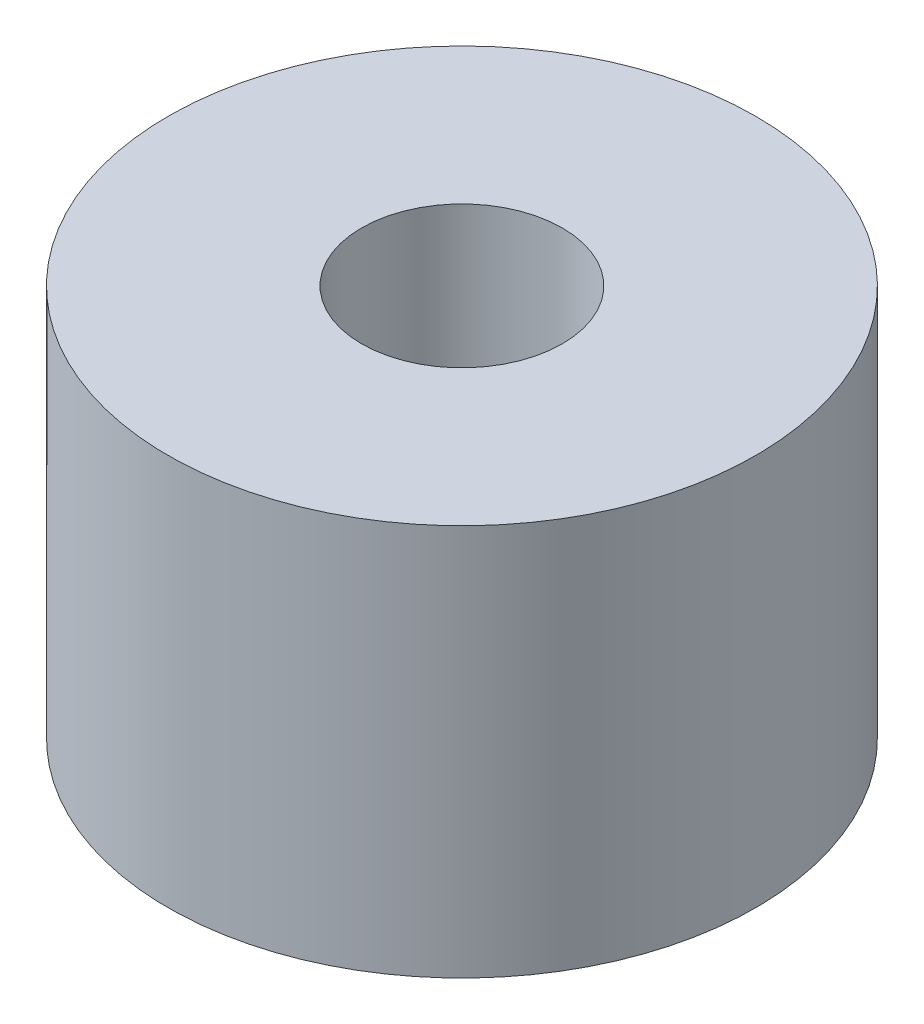
ISO-10303-21;
HEADER;
FILE_DESCRIPTION(('STEP AP214'),'2;1');
FILE_NAME('part.step','',(''),(''),'','','');
FILE_SCHEMA(('AUTOMOTIVE_DESIGN { 1 0 10303 214 1 1 1 1 }'));
ENDSEC;
DATA;
#1=APPLICATION_CONTEXT('core data for automotive mechanical design processes');
#2=APPLICATION_PROTOCOL_DEFINITION('international standard','automotive_design',2000,#1);
#3=PRODUCT_CONTEXT('',#1,'mechanical');
#4=PRODUCT('Part','Part','',(#3));
#5=PRODUCT_RELATED_PRODUCT_CATEGORY('part','',(#4));
#6=PRODUCT_DEFINITION_FORMATION('','',#4);
#7=PRODUCT_DEFINITION_CONTEXT('part definition',#1,'design');
#8=PRODUCT_DEFINITION('design','',#6,#7);
#9=PRODUCT_DEFINITION_SHAPE('','',#8);
#10=(LENGTH_UNIT() NAMED_UNIT(*) SI_UNIT(.MILLI.,.METRE.));
#11=(NAMED_UNIT(*) PLANE_ANGLE_UNIT() SI_UNIT($,.RADIAN.));
#12=(NAMED_UNIT(*) SI_UNIT($,.STERADIAN.) SOLID_ANGLE_UNIT());
#13=UNCERTAINTY_MEASURE_WITH_UNIT(LENGTH_MEASURE(1.E-05),#10,'distance_accuracy_value','');
#14=(GEOMETRIC_REPRESENTATION_CONTEXT(3) GLOBAL_UNCERTAINTY_ASSIGNED_CONTEXT((#13)) GLOBAL_UNIT_ASSIGNED_CONTEXT((#10,
#11,#12)) REPRESENTATION_CONTEXT('',''));
#15=CARTESIAN_POINT('',(0.,0.,0.));
#16=DIRECTION('',(0.,0.,1.));
#17=DIRECTION('',(1.,0.,0.));
#18=AXIS2_PLACEMENT_3D('',#15,#16,#17);
#19=CARTESIAN_POINT('',(0.,8.,0.));
#20=DIRECTION('',(0.,-1.,0.));
#21=DIRECTION('',(0.,0.,-1.));
#22=AXIS2_PLACEMENT_3D('',#19,#20,#21);
#23=CYLINDRICAL_SURFACE('',#22,2.05);
#24=CARTESIAN_POINT('',(0.,0.,0.));
#25=DIRECTION('',(0.,-1.,0.));
#26=DIRECTION('',(0.,0.,-1.));
#27=AXIS2_PLACEMENT_3D('',#24,#25,#26);
#28=CIRCLE('',#27,2.05);
#29=CARTESIAN_POINT('',(0.,0.,-2.05));
#30=VERTEX_POINT('',#29);
#31=EDGE_CURVE('E26',#30,#30,#28,.T.);
#32=ORIENTED_EDGE('',*,*,#31,.T.);
#33=EDGE_LOOP('',(#32));
#34=FACE_BOUND('',#33,.T.);
#35=CARTESIAN_POINT('',(0.,8.,0.));
#36=DIRECTION('',(0.,-1.,0.));
#37=DIRECTION('',(0.,0.,-1.));
#38=AXIS2_PLACEMENT_3D('',#35,#36,#37);
#39=CIRCLE('',#38,2.05);
#40=CARTESIAN_POINT('',(0.,8.,-2.05));
#41=VERTEX_POINT('',#40);
#42=EDGE_CURVE('E17',#41,#41,#39,.T.);
#43=ORIENTED_EDGE('',*,*,#42,.F.);
#44=EDGE_LOOP('',(#43));
#45=FACE_BOUND('',#44,.T.);
#46=ADVANCED_FACE('F14',(#34,#45),#23,.F.);
#47=CARTESIAN_POINT('',(0.,8.,0.));
#48=DIRECTION('',(0.,1.,0.));
#49=DIRECTION('',(0.,0.,1.));
#50=AXIS2_PLACEMENT_3D('',#47,#48,#49);
#51=PLANE('',#50);
#52=ORIENTED_EDGE('',*,*,#42,.T.);
#53=EDGE_LOOP('',(#52));
#54=FACE_BOUND('',#53,.T.);
#55=CARTESIAN_POINT('',(0.,8.,0.));
#56=DIRECTION('',(0.,-1.,0.));
#57=DIRECTION('',(0.,0.,-1.));
#58=AXIS2_PLACEMENT_3D('',#55,#56,#57);
#59=CIRCLE('',#58,6.);
#60=CARTESIAN_POINT('',(0.,8.,-6.));
#61=VERTEX_POINT('',#60);
#62=EDGE_CURVE('E21',#61,#61,#59,.T.);
#63=ORIENTED_EDGE('',*,*,#62,.F.);
#64=EDGE_LOOP('',(#63));
#65=FACE_BOUND('',#64,.T.);
#66=ADVANCED_FACE('F34',(#54,#65),#51,.T.);
#67=CARTESIAN_POINT('',(0.,0.,0.));
#68=DIRECTION('',(0.,1.,0.));
#69=DIRECTION('',(0.,0.,1.));
#70=AXIS2_PLACEMENT_3D('',#67,#68,#69);
#71=PLANE('',#70);
#72=ORIENTED_EDGE('',*,*,#31,.F.);
#73=EDGE_LOOP('',(#72));
#74=FACE_BOUND('',#73,.T.);
#75=CARTESIAN_POINT('',(0.,0.,0.));
#76=DIRECTION('',(0.,-1.,0.));
#77=DIRECTION('',(0.,0.,-1.));
#78=AXIS2_PLACEMENT_3D('',#75,#76,#77);
#79=CIRCLE('',#78,6.);
#80=CARTESIAN_POINT('',(0.,0.,-6.));
#81=VERTEX_POINT('',#80);
#82=EDGE_CURVE('E8',#81,#81,#79,.F.);
#83=ORIENTED_EDGE('',*,*,#82,.F.);
#84=EDGE_LOOP('',(#83));
#85=FACE_BOUND('',#84,.T.);
#86=ADVANCED_FACE('F41',(#74,#85),#71,.F.);
#87=CARTESIAN_POINT('',(0.,8.,0.));
#88=DIRECTION('',(0.,-1.,0.));
#89=DIRECTION('',(0.,0.,-1.));
#90=AXIS2_PLACEMENT_3D('',#87,#88,#89);
#91=CYLINDRICAL_SURFACE('',#90,6.);
#92=ORIENTED_EDGE('',*,*,#82,.T.);
#93=EDGE_LOOP('',(#92));
#94=FACE_BOUND('',#93,.T.);
#95=ORIENTED_EDGE('',*,*,#62,.T.);
#96=EDGE_LOOP('',(#95));
#97=FACE_BOUND('',#96,.T.);
#98=ADVANCED_FACE('F42',(#94,#97),#91,.T.);
#99=CLOSED_SHELL('',(#46,#66,#86,#98));
#100=MANIFOLD_SOLID_BREP('B1',#99);
#101=ADVANCED_BREP_SHAPE_REPRESENTATION('',(#18,#100),#14);
#102=SHAPE_DEFINITION_REPRESENTATION(#9,#101);
ENDSEC;
END-ISO-10303-21;
